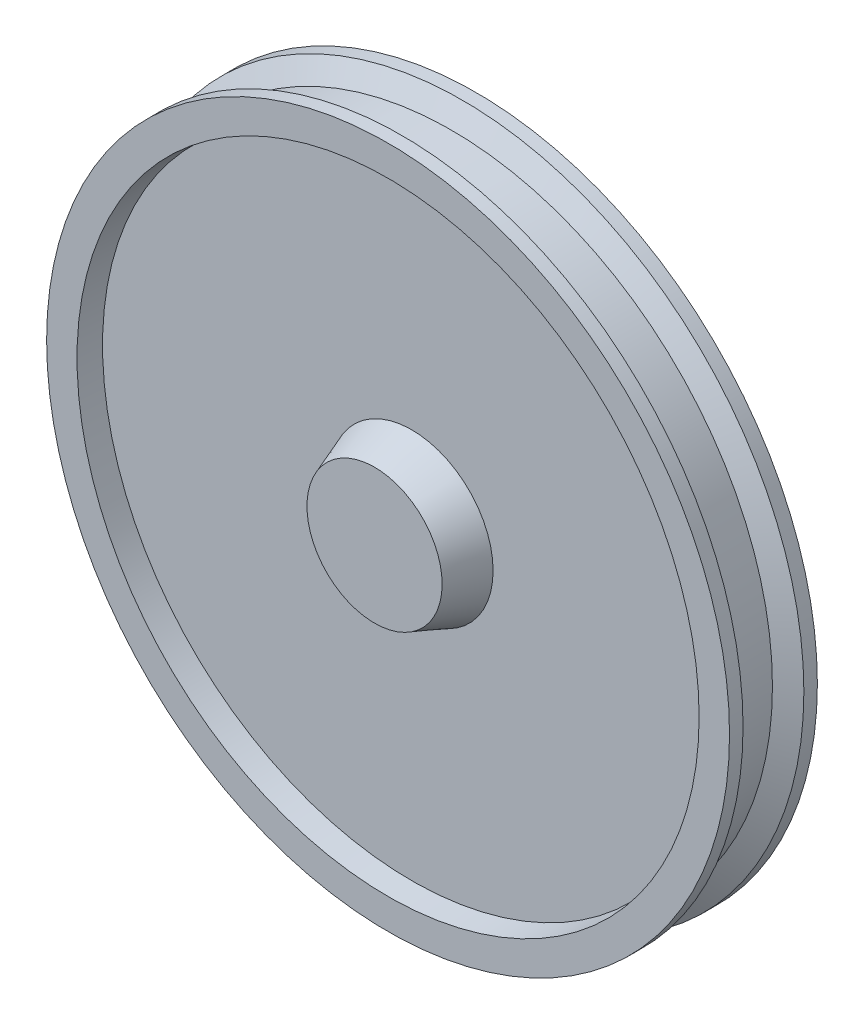
ISO-10303-21;
HEADER;
FILE_DESCRIPTION(('STEP AP214'),'2;1');
FILE_NAME('part.step','',(''),(''),'','','');
FILE_SCHEMA(('AUTOMOTIVE_DESIGN { 1 0 10303 214 1 1 1 1 }'));
ENDSEC;
DATA;
#1=APPLICATION_CONTEXT('core data for automotive mechanical design processes');
#2=APPLICATION_PROTOCOL_DEFINITION('international standard','automotive_design',2000,#1);
#3=PRODUCT_CONTEXT('',#1,'mechanical');
#4=PRODUCT('Part','Part','',(#3));
#5=PRODUCT_RELATED_PRODUCT_CATEGORY('part','',(#4));
#6=PRODUCT_DEFINITION_FORMATION('','',#4);
#7=PRODUCT_DEFINITION_CONTEXT('part definition',#1,'design');
#8=PRODUCT_DEFINITION('design','',#6,#7);
#9=PRODUCT_DEFINITION_SHAPE('','',#8);
#10=(LENGTH_UNIT() NAMED_UNIT(*) SI_UNIT(.MILLI.,.METRE.));
#11=(NAMED_UNIT(*) PLANE_ANGLE_UNIT() SI_UNIT($,.RADIAN.));
#12=(NAMED_UNIT(*) SI_UNIT($,.STERADIAN.) SOLID_ANGLE_UNIT());
#13=UNCERTAINTY_MEASURE_WITH_UNIT(LENGTH_MEASURE(1.E-05),#10,'distance_accuracy_value','');
#14=(GEOMETRIC_REPRESENTATION_CONTEXT(3) GLOBAL_UNCERTAINTY_ASSIGNED_CONTEXT((#13)) GLOBAL_UNIT_ASSIGNED_CONTEXT((#10,
#11,#12)) REPRESENTATION_CONTEXT('',''));
#15=CARTESIAN_POINT('',(0.,0.,0.));
#16=DIRECTION('',(0.,0.,1.));
#17=DIRECTION('',(1.,0.,0.));
#18=AXIS2_PLACEMENT_3D('',#15,#16,#17);
#19=CARTESIAN_POINT('',(0.,0.,-85.));
#20=DIRECTION('',(0.,0.,1.));
#21=DIRECTION('',(1.,0.,0.));
#22=AXIS2_PLACEMENT_3D('',#19,#20,#21);
#23=PLANE('',#22);
#24=CARTESIAN_POINT('',(0.,0.,-85.));
#25=DIRECTION('',(0.,0.,1.));
#26=DIRECTION('',(1.,0.,0.));
#27=AXIS2_PLACEMENT_3D('',#24,#25,#26);
#28=CIRCLE('',#27,100.);
#29=CARTESIAN_POINT('',(100.,0.,-85.));
#30=VERTEX_POINT('',#29);
#31=EDGE_CURVE('E10',#30,#30,#28,.T.);
#32=ORIENTED_EDGE('',*,*,#31,.F.);
#33=EDGE_LOOP('',(#32));
#34=FACE_BOUND('',#33,.T.);
#35=ADVANCED_FACE('F39',(#34),#23,.F.);
#36=CARTESIAN_POINT('',(0.,0.,-85.));
#37=DIRECTION('',(0.,0.,1.));
#38=DIRECTION('',(1.,0.,0.));
#39=AXIS2_PLACEMENT_3D('',#36,#37,#38);
#40=CONICAL_SURFACE('',#39,100.,0.355295525536823);
#41=CARTESIAN_POINT('',(0.,0.,-30.));
#42=DIRECTION('',(0.,0.,1.));
#43=DIRECTION('',(1.,0.,0.));
#44=AXIS2_PLACEMENT_3D('',#41,#42,#43);
#45=CIRCLE('',#44,120.407271829458);
#46=CARTESIAN_POINT('',(120.407271829458,0.,-30.));
#47=VERTEX_POINT('',#46);
#48=EDGE_CURVE('E45',#47,#47,#45,.T.);
#49=ORIENTED_EDGE('',*,*,#48,.F.);
#50=EDGE_LOOP('',(#49));
#51=FACE_BOUND('',#50,.T.);
#52=ORIENTED_EDGE('',*,*,#31,.T.);
#53=EDGE_LOOP('',(#52));
#54=FACE_BOUND('',#53,.T.);
#55=ADVANCED_FACE('F159',(#51,#54),#40,.T.);
#56=CARTESIAN_POINT('',(0.,120.407271829458,-30.));
#57=DIRECTION('',(0.,0.,1.));
#58=DIRECTION('',(1.,0.,0.));
#59=AXIS2_PLACEMENT_3D('',#56,#57,#58);
#60=PLANE('',#59);
#61=CARTESIAN_POINT('',(0.,0.,-30.));
#62=DIRECTION('',(0.,0.,1.));
#63=DIRECTION('',(1.,0.,0.));
#64=AXIS2_PLACEMENT_3D('',#61,#62,#63);
#65=CIRCLE('',#64,457.5);
#66=CARTESIAN_POINT('',(457.5,0.,-30.));
#67=VERTEX_POINT('',#66);
#68=EDGE_CURVE('E49',#67,#67,#65,.T.);
#69=ORIENTED_EDGE('',*,*,#68,.F.);
#70=EDGE_LOOP('',(#69));
#71=FACE_BOUND('',#70,.T.);
#72=ORIENTED_EDGE('',*,*,#48,.T.);
#73=EDGE_LOOP('',(#72));
#74=FACE_BOUND('',#73,.T.);
#75=ADVANCED_FACE('F154',(#71,#74),#60,.F.);
#76=CARTESIAN_POINT('',(0.,0.,-30.));
#77=DIRECTION('',(0.,0.,-1.));
#78=DIRECTION('',(-1.,0.,0.));
#79=AXIS2_PLACEMENT_3D('',#76,#77,#78);
#80=CONICAL_SURFACE('',#79,457.5,0.078539728759287);
#81=CARTESIAN_POINT('',(0.,0.,-65.0000000000001));
#82=DIRECTION('',(0.,0.,1.));
#83=DIRECTION('',(1.,0.,0.));
#84=AXIS2_PLACEMENT_3D('',#81,#82,#83);
#85=CIRCLE('',#84,460.254556654559);
#86=CARTESIAN_POINT('',(460.254556654559,0.,-65.0000000000001));
#87=VERTEX_POINT('',#86);
#88=EDGE_CURVE('E53',#87,#87,#85,.T.);
#89=ORIENTED_EDGE('',*,*,#88,.F.);
#90=EDGE_LOOP('',(#89));
#91=FACE_BOUND('',#90,.T.);
#92=ORIENTED_EDGE('',*,*,#68,.T.);
#93=EDGE_LOOP('',(#92));
#94=FACE_BOUND('',#93,.T.);
#95=ADVANCED_FACE('F148',(#91,#94),#80,.F.);
#96=CARTESIAN_POINT('',(0.,505.254556654559,-65.));
#97=DIRECTION('',(0.,0.,1.));
#98=DIRECTION('',(1.,0.,0.));
#99=AXIS2_PLACEMENT_3D('',#96,#97,#98);
#100=PLANE('',#99);
#101=CARTESIAN_POINT('',(0.,0.,-65.));
#102=DIRECTION('',(0.,0.,1.));
#103=DIRECTION('',(1.,0.,0.));
#104=AXIS2_PLACEMENT_3D('',#101,#102,#103);
#105=CIRCLE('',#104,505.254556654559);
#106=CARTESIAN_POINT('',(505.254556654559,0.,-65.));
#107=VERTEX_POINT('',#106);
#108=EDGE_CURVE('E58',#107,#107,#105,.T.);
#109=ORIENTED_EDGE('',*,*,#108,.F.);
#110=EDGE_LOOP('',(#109));
#111=FACE_BOUND('',#110,.T.);
#112=ORIENTED_EDGE('',*,*,#88,.T.);
#113=EDGE_LOOP('',(#112));
#114=FACE_BOUND('',#113,.T.);
#115=ADVANCED_FACE('F142',(#111,#114),#100,.F.);
#116=CARTESIAN_POINT('',(0.,0.,374.636327728789));
#117=DIRECTION('',(0.,0.,1.));
#118=DIRECTION('',(1.,0.,0.));
#119=AXIS2_PLACEMENT_3D('',#116,#117,#118);
#120=CYLINDRICAL_SURFACE('',#119,505.254556654559);
#121=CARTESIAN_POINT('',(0.,0.,-45.));
#122=DIRECTION('',(0.,0.,1.));
#123=DIRECTION('',(1.,0.,0.));
#124=AXIS2_PLACEMENT_3D('',#121,#122,#123);
#125=CIRCLE('',#124,505.254556654559);
#126=CARTESIAN_POINT('',(505.254556654559,0.,-45.));
#127=VERTEX_POINT('',#126);
#128=EDGE_CURVE('E61',#127,#127,#125,.T.);
#129=ORIENTED_EDGE('',*,*,#128,.F.);
#130=EDGE_LOOP('',(#129));
#131=FACE_BOUND('',#130,.T.);
#132=ORIENTED_EDGE('',*,*,#108,.T.);
#133=EDGE_LOOP('',(#132));
#134=FACE_BOUND('',#133,.T.);
#135=ADVANCED_FACE('F136',(#131,#134),#120,.T.);
#136=CARTESIAN_POINT('',(0.,0.,-45.));
#137=DIRECTION('',(0.,0.,-1.));
#138=DIRECTION('',(-1.,0.,0.));
#139=AXIS2_PLACEMENT_3D('',#136,#137,#138);
#140=CONICAL_SURFACE('',#139,505.254556654559,1.06816444156791);
#141=CARTESIAN_POINT('',(0.,0.,-28.5082565922279));
#142=DIRECTION('',(0.,0.,1.));
#143=DIRECTION('',(1.,0.,0.));
#144=AXIS2_PLACEMENT_3D('',#141,#142,#143);
#145=CIRCLE('',#144,475.254556654559);
#146=CARTESIAN_POINT('',(475.254556654559,0.,-28.5082565922279));
#147=VERTEX_POINT('',#146);
#148=EDGE_CURVE('E64',#147,#147,#145,.T.);
#149=ORIENTED_EDGE('',*,*,#148,.F.);
#150=EDGE_LOOP('',(#149));
#151=FACE_BOUND('',#150,.T.);
#152=ORIENTED_EDGE('',*,*,#128,.T.);
#153=EDGE_LOOP('',(#152));
#154=FACE_BOUND('',#153,.T.);
#155=ADVANCED_FACE('F130',(#151,#154),#140,.T.);
#156=CARTESIAN_POINT('',(0.,0.,374.636327728789));
#157=DIRECTION('',(0.,0.,1.));
#158=DIRECTION('',(1.,0.,0.));
#159=AXIS2_PLACEMENT_3D('',#156,#157,#158);
#160=CYLINDRICAL_SURFACE('',#159,475.254556654559);
#161=CARTESIAN_POINT('',(0.,0.,28.5082565922279));
#162=DIRECTION('',(0.,0.,1.));
#163=DIRECTION('',(1.,0.,0.));
#164=AXIS2_PLACEMENT_3D('',#161,#162,#163);
#165=CIRCLE('',#164,475.254556654559);
#166=CARTESIAN_POINT('',(475.254556654559,0.,28.5082565922279));
#167=VERTEX_POINT('',#166);
#168=EDGE_CURVE('E67',#167,#167,#165,.T.);
#169=ORIENTED_EDGE('',*,*,#168,.F.);
#170=EDGE_LOOP('',(#169));
#171=FACE_BOUND('',#170,.T.);
#172=ORIENTED_EDGE('',*,*,#148,.T.);
#173=EDGE_LOOP('',(#172));
#174=FACE_BOUND('',#173,.T.);
#175=ADVANCED_FACE('F124',(#171,#174),#160,.T.);
#176=CARTESIAN_POINT('',(0.,0.,28.5082565922279));
#177=DIRECTION('',(0.,0.,1.));
#178=DIRECTION('',(1.,0.,0.));
#179=AXIS2_PLACEMENT_3D('',#176,#177,#178);
#180=CONICAL_SURFACE('',#179,475.254556654559,1.06816444156791);
#181=CARTESIAN_POINT('',(0.,0.,45.));
#182=DIRECTION('',(0.,0.,1.));
#183=DIRECTION('',(1.,0.,0.));
#184=AXIS2_PLACEMENT_3D('',#181,#182,#183);
#185=CIRCLE('',#184,505.254556654559);
#186=CARTESIAN_POINT('',(505.254556654559,0.,45.));
#187=VERTEX_POINT('',#186);
#188=EDGE_CURVE('E70',#187,#187,#185,.T.);
#189=ORIENTED_EDGE('',*,*,#188,.F.);
#190=EDGE_LOOP('',(#189));
#191=FACE_BOUND('',#190,.T.);
#192=ORIENTED_EDGE('',*,*,#168,.T.);
#193=EDGE_LOOP('',(#192));
#194=FACE_BOUND('',#193,.T.);
#195=ADVANCED_FACE('F118',(#191,#194),#180,.T.);
#196=CARTESIAN_POINT('',(0.,0.,374.636327728789));
#197=DIRECTION('',(0.,0.,1.));
#198=DIRECTION('',(1.,0.,0.));
#199=AXIS2_PLACEMENT_3D('',#196,#197,#198);
#200=CYLINDRICAL_SURFACE('',#199,505.254556654559);
#201=CARTESIAN_POINT('',(0.,0.,65.));
#202=DIRECTION('',(0.,0.,1.));
#203=DIRECTION('',(1.,0.,0.));
#204=AXIS2_PLACEMENT_3D('',#201,#202,#203);
#205=CIRCLE('',#204,505.254556654559);
#206=CARTESIAN_POINT('',(505.254556654559,0.,65.));
#207=VERTEX_POINT('',#206);
#208=EDGE_CURVE('E73',#207,#207,#205,.T.);
#209=ORIENTED_EDGE('',*,*,#208,.F.);
#210=EDGE_LOOP('',(#209));
#211=FACE_BOUND('',#210,.T.);
#212=ORIENTED_EDGE('',*,*,#188,.T.);
#213=EDGE_LOOP('',(#212));
#214=FACE_BOUND('',#213,.T.);
#215=ADVANCED_FACE('F112',(#211,#214),#200,.T.);
#216=CARTESIAN_POINT('',(0.,460.254556654559,65.));
#217=DIRECTION('',(0.,0.,-1.));
#218=DIRECTION('',(-1.,0.,0.));
#219=AXIS2_PLACEMENT_3D('',#216,#217,#218);
#220=PLANE('',#219);
#221=CARTESIAN_POINT('',(0.,0.,65.));
#222=DIRECTION('',(0.,0.,1.));
#223=DIRECTION('',(1.,0.,0.));
#224=AXIS2_PLACEMENT_3D('',#221,#222,#223);
#225=CIRCLE('',#224,460.254556654559);
#226=CARTESIAN_POINT('',(460.254556654559,0.,65.));
#227=VERTEX_POINT('',#226);
#228=EDGE_CURVE('E76',#227,#227,#225,.T.);
#229=ORIENTED_EDGE('',*,*,#228,.F.);
#230=EDGE_LOOP('',(#229));
#231=FACE_BOUND('',#230,.T.);
#232=ORIENTED_EDGE('',*,*,#208,.T.);
#233=EDGE_LOOP('',(#232));
#234=FACE_BOUND('',#233,.T.);
#235=ADVANCED_FACE('F106',(#231,#234),#220,.F.);
#236=CARTESIAN_POINT('',(0.,0.,65.));
#237=DIRECTION('',(0.,0.,1.));
#238=DIRECTION('',(1.,0.,0.));
#239=AXIS2_PLACEMENT_3D('',#236,#237,#238);
#240=CONICAL_SURFACE('',#239,460.254556654559,0.0785397287592839);
#241=CARTESIAN_POINT('',(0.,0.,30.));
#242=DIRECTION('',(0.,0.,1.));
#243=DIRECTION('',(1.,0.,0.));
#244=AXIS2_PLACEMENT_3D('',#241,#242,#243);
#245=CIRCLE('',#244,457.5);
#246=CARTESIAN_POINT('',(457.5,0.,30.));
#247=VERTEX_POINT('',#246);
#248=EDGE_CURVE('E79',#247,#247,#245,.T.);
#249=ORIENTED_EDGE('',*,*,#248,.F.);
#250=EDGE_LOOP('',(#249));
#251=FACE_BOUND('',#250,.T.);
#252=ORIENTED_EDGE('',*,*,#228,.T.);
#253=EDGE_LOOP('',(#252));
#254=FACE_BOUND('',#253,.T.);
#255=ADVANCED_FACE('F100',(#251,#254),#240,.F.);
#256=CARTESIAN_POINT('',(0.,120.407271829458,30.));
#257=DIRECTION('',(0.,0.,-1.));
#258=DIRECTION('',(-1.,0.,0.));
#259=AXIS2_PLACEMENT_3D('',#256,#257,#258);
#260=PLANE('',#259);
#261=CARTESIAN_POINT('',(0.,0.,30.));
#262=DIRECTION('',(0.,0.,1.));
#263=DIRECTION('',(1.,0.,0.));
#264=AXIS2_PLACEMENT_3D('',#261,#262,#263);
#265=CIRCLE('',#264,120.407271829458);
#266=CARTESIAN_POINT('',(120.407271829458,0.,30.));
#267=VERTEX_POINT('',#266);
#268=EDGE_CURVE('E82',#267,#267,#265,.T.);
#269=ORIENTED_EDGE('',*,*,#268,.F.);
#270=EDGE_LOOP('',(#269));
#271=FACE_BOUND('',#270,.T.);
#272=ORIENTED_EDGE('',*,*,#248,.T.);
#273=EDGE_LOOP('',(#272));
#274=FACE_BOUND('',#273,.T.);
#275=ADVANCED_FACE('F94',(#271,#274),#260,.F.);
#276=CARTESIAN_POINT('',(0.,0.,30.));
#277=DIRECTION('',(0.,0.,-1.));
#278=DIRECTION('',(-1.,0.,0.));
#279=AXIS2_PLACEMENT_3D('',#276,#277,#278);
#280=CONICAL_SURFACE('',#279,120.407271829458,0.355295525536823);
#281=CARTESIAN_POINT('',(0.,0.,85.));
#282=DIRECTION('',(0.,0.,1.));
#283=DIRECTION('',(1.,0.,0.));
#284=AXIS2_PLACEMENT_3D('',#281,#282,#283);
#285=CIRCLE('',#284,100.);
#286=CARTESIAN_POINT('',(100.,0.,85.));
#287=VERTEX_POINT('',#286);
#288=EDGE_CURVE('E85',#287,#287,#285,.T.);
#289=ORIENTED_EDGE('',*,*,#288,.F.);
#290=EDGE_LOOP('',(#289));
#291=FACE_BOUND('',#290,.T.);
#292=ORIENTED_EDGE('',*,*,#268,.T.);
#293=EDGE_LOOP('',(#292));
#294=FACE_BOUND('',#293,.T.);
#295=ADVANCED_FACE('F91',(#291,#294),#280,.T.);
#296=CARTESIAN_POINT('',(0.,0.,85.));
#297=DIRECTION('',(0.,0.,-1.));
#298=DIRECTION('',(-1.,0.,0.));
#299=AXIS2_PLACEMENT_3D('',#296,#297,#298);
#300=PLANE('',#299);
#301=ORIENTED_EDGE('',*,*,#288,.T.);
#302=EDGE_LOOP('',(#301));
#303=FACE_BOUND('',#302,.T.);
#304=ADVANCED_FACE('F89',(#303),#300,.F.);
#305=CLOSED_SHELL('',(#35,#55,#75,#95,#115,#135,#155,#175,#195,#215,#235,#255,#275,#295,#304));
#306=MANIFOLD_SOLID_BREP('B2',#305);
#307=ADVANCED_BREP_SHAPE_REPRESENTATION('',(#18,#306),#14);
#308=SHAPE_DEFINITION_REPRESENTATION(#9,#307);
ENDSEC;
END-ISO-10303-21;
